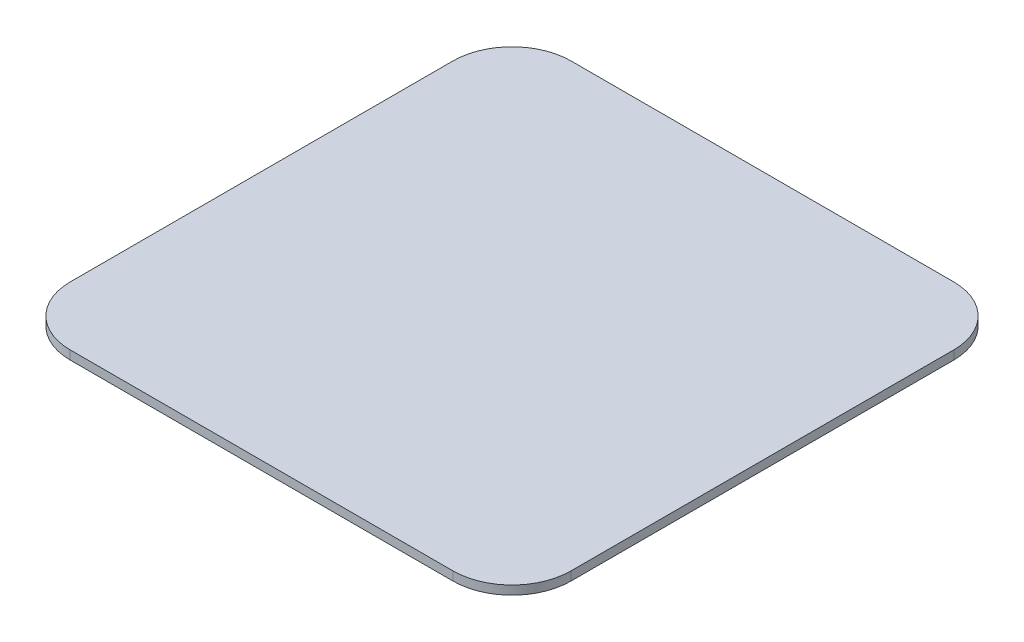
ISO-10303-21;
HEADER;
FILE_DESCRIPTION(('STEP AP214'),'2;1');
FILE_NAME('part.step','',(''),(''),'','','');
FILE_SCHEMA(('AUTOMOTIVE_DESIGN { 1 0 10303 214 1 1 1 1 }'));
ENDSEC;
DATA;
#1=APPLICATION_CONTEXT('core data for automotive mechanical design processes');
#2=APPLICATION_PROTOCOL_DEFINITION('international standard','automotive_design',2000,#1);
#3=PRODUCT_CONTEXT('',#1,'mechanical');
#4=PRODUCT('Part','Part','',(#3));
#5=PRODUCT_RELATED_PRODUCT_CATEGORY('part','',(#4));
#6=PRODUCT_DEFINITION_FORMATION('','',#4);
#7=PRODUCT_DEFINITION_CONTEXT('part definition',#1,'design');
#8=PRODUCT_DEFINITION('design','',#6,#7);
#9=PRODUCT_DEFINITION_SHAPE('','',#8);
#10=(LENGTH_UNIT() NAMED_UNIT(*) SI_UNIT(.MILLI.,.METRE.));
#11=(NAMED_UNIT(*) PLANE_ANGLE_UNIT() SI_UNIT($,.RADIAN.));
#12=(NAMED_UNIT(*) SI_UNIT($,.STERADIAN.) SOLID_ANGLE_UNIT());
#13=UNCERTAINTY_MEASURE_WITH_UNIT(LENGTH_MEASURE(1.E-05),#10,'distance_accuracy_value','');
#14=(GEOMETRIC_REPRESENTATION_CONTEXT(3) GLOBAL_UNCERTAINTY_ASSIGNED_CONTEXT((#13)) GLOBAL_UNIT_ASSIGNED_CONTEXT((#10,
#11,#12)) REPRESENTATION_CONTEXT('',''));
#15=CARTESIAN_POINT('',(0.,0.,0.));
#16=DIRECTION('',(0.,0.,1.));
#17=DIRECTION('',(1.,0.,0.));
#18=AXIS2_PLACEMENT_3D('',#15,#16,#17);
#19=CARTESIAN_POINT('',(85.,3.,85.));
#20=DIRECTION('',(-1.,0.,0.));
#21=DIRECTION('',(0.,0.,1.));
#22=AXIS2_PLACEMENT_3D('',#19,#20,#21);
#23=PLANE('',#22);
#24=DIRECTION('',(0.,0.,-1.));
#25=VECTOR('',#24,1.);
#26=CARTESIAN_POINT('',(85.,0.,85.));
#27=LINE('',#26,#25);
#28=CARTESIAN_POINT('',(85.,0.,65.));
#29=VERTEX_POINT('',#28);
#30=CARTESIAN_POINT('',(85.,0.,-65.));
#31=VERTEX_POINT('',#30);
#32=EDGE_CURVE('E157',#29,#31,#27,.T.);
#33=ORIENTED_EDGE('',*,*,#32,.T.);
#34=DIRECTION('',(0.,-1.,0.));
#35=VECTOR('',#34,1.);
#36=CARTESIAN_POINT('',(85.,3.,-65.));
#37=LINE('',#36,#35);
#38=CARTESIAN_POINT('',(85.,3.,-65.));
#39=VERTEX_POINT('',#38);
#40=EDGE_CURVE('E11',#31,#39,#37,.F.);
#41=ORIENTED_EDGE('',*,*,#40,.T.);
#42=DIRECTION('',(0.,0.,-1.));
#43=VECTOR('',#42,1.);
#44=CARTESIAN_POINT('',(85.,3.,85.));
#45=LINE('',#44,#43);
#46=CARTESIAN_POINT('',(85.,3.,65.));
#47=VERTEX_POINT('',#46);
#48=EDGE_CURVE('E125',#47,#39,#45,.T.);
#49=ORIENTED_EDGE('',*,*,#48,.F.);
#50=DIRECTION('',(0.,-1.,0.));
#51=VECTOR('',#50,1.);
#52=CARTESIAN_POINT('',(85.,3.,65.));
#53=LINE('',#52,#51);
#54=EDGE_CURVE('E41',#47,#29,#53,.T.);
#55=ORIENTED_EDGE('',*,*,#54,.T.);
#56=EDGE_LOOP('',(#33,#41,#49,#55));
#57=FACE_BOUND('',#56,.T.);
#58=ADVANCED_FACE('F33',(#57),#23,.F.);
#59=CARTESIAN_POINT('',(-85.,3.,-85.));
#60=DIRECTION('',(0.,0.,1.));
#61=DIRECTION('',(1.,0.,0.));
#62=AXIS2_PLACEMENT_3D('',#59,#60,#61);
#63=PLANE('',#62);
#64=DIRECTION('',(-1.,0.,0.));
#65=VECTOR('',#64,1.);
#66=CARTESIAN_POINT('',(-85.,0.,-85.));
#67=LINE('',#66,#65);
#68=CARTESIAN_POINT('',(65.,0.,-85.));
#69=VERTEX_POINT('',#68);
#70=CARTESIAN_POINT('',(-65.,0.,-85.));
#71=VERTEX_POINT('',#70);
#72=EDGE_CURVE('E130',#69,#71,#67,.T.);
#73=ORIENTED_EDGE('',*,*,#72,.T.);
#74=DIRECTION('',(0.,-1.,0.));
#75=VECTOR('',#74,1.);
#76=CARTESIAN_POINT('',(-65.,3.,-85.));
#77=LINE('',#76,#75);
#78=CARTESIAN_POINT('',(-65.,3.,-85.));
#79=VERTEX_POINT('',#78);
#80=EDGE_CURVE('E48',#71,#79,#77,.F.);
#81=ORIENTED_EDGE('',*,*,#80,.T.);
#82=DIRECTION('',(-1.,0.,0.));
#83=VECTOR('',#82,1.);
#84=CARTESIAN_POINT('',(-85.,3.,-85.));
#85=LINE('',#84,#83);
#86=CARTESIAN_POINT('',(65.,3.,-85.));
#87=VERTEX_POINT('',#86);
#88=EDGE_CURVE('E128',#87,#79,#85,.T.);
#89=ORIENTED_EDGE('',*,*,#88,.F.);
#90=DIRECTION('',(0.,-1.,0.));
#91=VECTOR('',#90,1.);
#92=CARTESIAN_POINT('',(65.,3.,-85.));
#93=LINE('',#92,#91);
#94=EDGE_CURVE('E149',#87,#69,#93,.T.);
#95=ORIENTED_EDGE('',*,*,#94,.T.);
#96=EDGE_LOOP('',(#73,#81,#89,#95));
#97=FACE_BOUND('',#96,.T.);
#98=ADVANCED_FACE('F177',(#97),#63,.F.);
#99=CARTESIAN_POINT('',(-85.,3.,85.));
#100=DIRECTION('',(1.,0.,0.));
#101=DIRECTION('',(0.,0.,-1.));
#102=AXIS2_PLACEMENT_3D('',#99,#100,#101);
#103=PLANE('',#102);
#104=DIRECTION('',(0.,0.,1.));
#105=VECTOR('',#104,1.);
#106=CARTESIAN_POINT('',(-85.,0.,85.));
#107=LINE('',#106,#105);
#108=CARTESIAN_POINT('',(-85.,0.,-65.));
#109=VERTEX_POINT('',#108);
#110=CARTESIAN_POINT('',(-85.,0.,65.));
#111=VERTEX_POINT('',#110);
#112=EDGE_CURVE('E126',#109,#111,#107,.T.);
#113=ORIENTED_EDGE('',*,*,#112,.T.);
#114=DIRECTION('',(0.,-1.,0.));
#115=VECTOR('',#114,1.);
#116=CARTESIAN_POINT('',(-85.,3.,65.));
#117=LINE('',#116,#115);
#118=CARTESIAN_POINT('',(-85.,3.,65.));
#119=VERTEX_POINT('',#118);
#120=EDGE_CURVE('E104',#111,#119,#117,.F.);
#121=ORIENTED_EDGE('',*,*,#120,.T.);
#122=DIRECTION('',(0.,0.,1.));
#123=VECTOR('',#122,1.);
#124=CARTESIAN_POINT('',(-85.,3.,85.));
#125=LINE('',#124,#123);
#126=CARTESIAN_POINT('',(-85.,3.,-65.));
#127=VERTEX_POINT('',#126);
#128=EDGE_CURVE('E165',#127,#119,#125,.T.);
#129=ORIENTED_EDGE('',*,*,#128,.F.);
#130=DIRECTION('',(0.,-1.,0.));
#131=VECTOR('',#130,1.);
#132=CARTESIAN_POINT('',(-85.,3.,-65.));
#133=LINE('',#132,#131);
#134=EDGE_CURVE('E109',#127,#109,#133,.T.);
#135=ORIENTED_EDGE('',*,*,#134,.T.);
#136=EDGE_LOOP('',(#113,#121,#129,#135));
#137=FACE_BOUND('',#136,.T.);
#138=ADVANCED_FACE('F176',(#137),#103,.F.);
#139=CARTESIAN_POINT('',(-85.,3.,85.));
#140=DIRECTION('',(0.,0.,-1.));
#141=DIRECTION('',(-1.,0.,0.));
#142=AXIS2_PLACEMENT_3D('',#139,#140,#141);
#143=PLANE('',#142);
#144=DIRECTION('',(1.,0.,0.));
#145=VECTOR('',#144,1.);
#146=CARTESIAN_POINT('',(-85.,3.,85.));
#147=LINE('',#146,#145);
#148=CARTESIAN_POINT('',(-65.,3.,85.));
#149=VERTEX_POINT('',#148);
#150=CARTESIAN_POINT('',(65.,3.,85.));
#151=VERTEX_POINT('',#150);
#152=EDGE_CURVE('E119',#149,#151,#147,.T.);
#153=ORIENTED_EDGE('',*,*,#152,.F.);
#154=DIRECTION('',(0.,-1.,0.));
#155=VECTOR('',#154,1.);
#156=CARTESIAN_POINT('',(-65.,3.,85.));
#157=LINE('',#156,#155);
#158=CARTESIAN_POINT('',(-65.,0.,85.));
#159=VERTEX_POINT('',#158);
#160=EDGE_CURVE('E103',#149,#159,#157,.T.);
#161=ORIENTED_EDGE('',*,*,#160,.T.);
#162=DIRECTION('',(1.,0.,0.));
#163=VECTOR('',#162,1.);
#164=CARTESIAN_POINT('',(-85.,0.,85.));
#165=LINE('',#164,#163);
#166=CARTESIAN_POINT('',(65.,0.,85.));
#167=VERTEX_POINT('',#166);
#168=EDGE_CURVE('E116',#159,#167,#165,.T.);
#169=ORIENTED_EDGE('',*,*,#168,.T.);
#170=DIRECTION('',(0.,-1.,0.));
#171=VECTOR('',#170,1.);
#172=CARTESIAN_POINT('',(65.,3.,85.));
#173=LINE('',#172,#171);
#174=EDGE_CURVE('E121',#167,#151,#173,.F.);
#175=ORIENTED_EDGE('',*,*,#174,.T.);
#176=EDGE_LOOP('',(#153,#161,#169,#175));
#177=FACE_BOUND('',#176,.T.);
#178=ADVANCED_FACE('F115',(#177),#143,.F.);
#179=CARTESIAN_POINT('',(0.,3.,0.));
#180=DIRECTION('',(0.,-1.,0.));
#181=DIRECTION('',(0.,0.,-1.));
#182=AXIS2_PLACEMENT_3D('',#179,#180,#181);
#183=PLANE('',#182);
#184=ORIENTED_EDGE('',*,*,#128,.T.);
#185=CARTESIAN_POINT('',(-65.,3.,65.));
#186=DIRECTION('',(0.,-1.,0.));
#187=DIRECTION('',(0.,0.,-1.));
#188=AXIS2_PLACEMENT_3D('',#185,#186,#187);
#189=CIRCLE('',#188,20.);
#190=EDGE_CURVE('E147',#119,#149,#189,.F.);
#191=ORIENTED_EDGE('',*,*,#190,.T.);
#192=ORIENTED_EDGE('',*,*,#152,.T.);
#193=CARTESIAN_POINT('',(65.,3.,65.));
#194=DIRECTION('',(0.,-1.,0.));
#195=DIRECTION('',(0.,0.,-1.));
#196=AXIS2_PLACEMENT_3D('',#193,#194,#195);
#197=CIRCLE('',#196,20.);
#198=EDGE_CURVE('E142',#151,#47,#197,.F.);
#199=ORIENTED_EDGE('',*,*,#198,.T.);
#200=ORIENTED_EDGE('',*,*,#48,.T.);
#201=CARTESIAN_POINT('',(65.,3.,-65.));
#202=DIRECTION('',(0.,-1.,0.));
#203=DIRECTION('',(0.,0.,-1.));
#204=AXIS2_PLACEMENT_3D('',#201,#202,#203);
#205=CIRCLE('',#204,20.);
#206=EDGE_CURVE('E55',#39,#87,#205,.F.);
#207=ORIENTED_EDGE('',*,*,#206,.T.);
#208=ORIENTED_EDGE('',*,*,#88,.T.);
#209=CARTESIAN_POINT('',(-65.,3.,-65.));
#210=DIRECTION('',(0.,-1.,0.));
#211=DIRECTION('',(0.,0.,-1.));
#212=AXIS2_PLACEMENT_3D('',#209,#210,#211);
#213=CIRCLE('',#212,20.);
#214=EDGE_CURVE('E145',#79,#127,#213,.F.);
#215=ORIENTED_EDGE('',*,*,#214,.T.);
#216=EDGE_LOOP('',(#184,#191,#192,#199,#200,#207,#208,#215));
#217=FACE_BOUND('',#216,.T.);
#218=ADVANCED_FACE('F169',(#217),#183,.F.);
#219=CARTESIAN_POINT('',(0.,0.,0.));
#220=DIRECTION('',(0.,-1.,0.));
#221=DIRECTION('',(0.,0.,-1.));
#222=AXIS2_PLACEMENT_3D('',#219,#220,#221);
#223=PLANE('',#222);
#224=ORIENTED_EDGE('',*,*,#168,.F.);
#225=CARTESIAN_POINT('',(-65.,0.,65.));
#226=DIRECTION('',(0.,-1.,0.));
#227=DIRECTION('',(0.,0.,-1.));
#228=AXIS2_PLACEMENT_3D('',#225,#226,#227);
#229=CIRCLE('',#228,20.);
#230=EDGE_CURVE('E99',#159,#111,#229,.T.);
#231=ORIENTED_EDGE('',*,*,#230,.T.);
#232=ORIENTED_EDGE('',*,*,#112,.F.);
#233=CARTESIAN_POINT('',(-65.,0.,-65.));
#234=DIRECTION('',(0.,-1.,0.));
#235=DIRECTION('',(0.,0.,-1.));
#236=AXIS2_PLACEMENT_3D('',#233,#234,#235);
#237=CIRCLE('',#236,20.);
#238=EDGE_CURVE('E110',#109,#71,#237,.T.);
#239=ORIENTED_EDGE('',*,*,#238,.T.);
#240=ORIENTED_EDGE('',*,*,#72,.F.);
#241=CARTESIAN_POINT('',(65.,0.,-65.));
#242=DIRECTION('',(0.,-1.,0.));
#243=DIRECTION('',(0.,0.,-1.));
#244=AXIS2_PLACEMENT_3D('',#241,#242,#243);
#245=CIRCLE('',#244,20.);
#246=EDGE_CURVE('E136',#69,#31,#245,.T.);
#247=ORIENTED_EDGE('',*,*,#246,.T.);
#248=ORIENTED_EDGE('',*,*,#32,.F.);
#249=CARTESIAN_POINT('',(65.,0.,65.));
#250=DIRECTION('',(0.,-1.,0.));
#251=DIRECTION('',(0.,0.,-1.));
#252=AXIS2_PLACEMENT_3D('',#249,#250,#251);
#253=CIRCLE('',#252,20.);
#254=EDGE_CURVE('E120',#29,#167,#253,.T.);
#255=ORIENTED_EDGE('',*,*,#254,.T.);
#256=EDGE_LOOP('',(#224,#231,#232,#239,#240,#247,#248,#255));
#257=FACE_BOUND('',#256,.T.);
#258=ADVANCED_FACE('F123',(#257),#223,.T.);
#259=CARTESIAN_POINT('',(-65.,3.,65.));
#260=DIRECTION('',(0.,-1.,0.));
#261=DIRECTION('',(0.,0.,-1.));
#262=AXIS2_PLACEMENT_3D('',#259,#260,#261);
#263=CYLINDRICAL_SURFACE('',#262,20.);
#264=ORIENTED_EDGE('',*,*,#190,.F.);
#265=ORIENTED_EDGE('',*,*,#120,.F.);
#266=ORIENTED_EDGE('',*,*,#230,.F.);
#267=ORIENTED_EDGE('',*,*,#160,.F.);
#268=EDGE_LOOP('',(#264,#265,#266,#267));
#269=FACE_BOUND('',#268,.T.);
#270=ADVANCED_FACE('F102',(#269),#263,.T.);
#271=CARTESIAN_POINT('',(-65.,3.,-65.));
#272=DIRECTION('',(0.,-1.,0.));
#273=DIRECTION('',(0.,0.,-1.));
#274=AXIS2_PLACEMENT_3D('',#271,#272,#273);
#275=CYLINDRICAL_SURFACE('',#274,20.);
#276=ORIENTED_EDGE('',*,*,#214,.F.);
#277=ORIENTED_EDGE('',*,*,#80,.F.);
#278=ORIENTED_EDGE('',*,*,#238,.F.);
#279=ORIENTED_EDGE('',*,*,#134,.F.);
#280=EDGE_LOOP('',(#276,#277,#278,#279));
#281=FACE_BOUND('',#280,.T.);
#282=ADVANCED_FACE('F174',(#281),#275,.T.);
#283=CARTESIAN_POINT('',(65.,3.,-65.));
#284=DIRECTION('',(0.,-1.,0.));
#285=DIRECTION('',(0.,0.,-1.));
#286=AXIS2_PLACEMENT_3D('',#283,#284,#285);
#287=CYLINDRICAL_SURFACE('',#286,20.);
#288=ORIENTED_EDGE('',*,*,#206,.F.);
#289=ORIENTED_EDGE('',*,*,#40,.F.);
#290=ORIENTED_EDGE('',*,*,#246,.F.);
#291=ORIENTED_EDGE('',*,*,#94,.F.);
#292=EDGE_LOOP('',(#288,#289,#290,#291));
#293=FACE_BOUND('',#292,.T.);
#294=ADVANCED_FACE('F179',(#293),#287,.T.);
#295=CARTESIAN_POINT('',(65.,3.,65.));
#296=DIRECTION('',(0.,-1.,0.));
#297=DIRECTION('',(0.,0.,-1.));
#298=AXIS2_PLACEMENT_3D('',#295,#296,#297);
#299=CYLINDRICAL_SURFACE('',#298,20.);
#300=ORIENTED_EDGE('',*,*,#198,.F.);
#301=ORIENTED_EDGE('',*,*,#174,.F.);
#302=ORIENTED_EDGE('',*,*,#254,.F.);
#303=ORIENTED_EDGE('',*,*,#54,.F.);
#304=EDGE_LOOP('',(#300,#301,#302,#303));
#305=FACE_BOUND('',#304,.T.);
#306=ADVANCED_FACE('F35',(#305),#299,.T.);
#307=CLOSED_SHELL('',(#58,#98,#138,#178,#218,#258,#270,#282,#294,#306));
#308=MANIFOLD_SOLID_BREP('B2',#307);
#309=ADVANCED_BREP_SHAPE_REPRESENTATION('',(#18,#308),#14);
#310=SHAPE_DEFINITION_REPRESENTATION(#9,#309);
ENDSEC;
END-ISO-10303-21;
